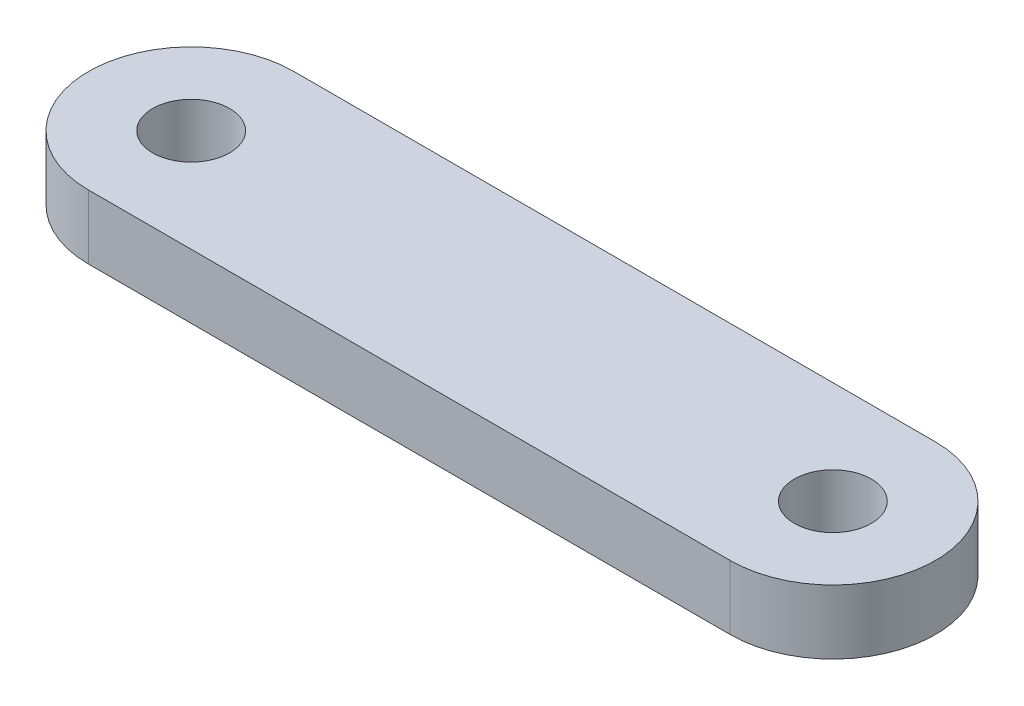
ISO-10303-21;
HEADER;
FILE_DESCRIPTION(('STEP AP214'),'2;1');
FILE_NAME('part.step','',(''),(''),'','','');
FILE_SCHEMA(('AUTOMOTIVE_DESIGN { 1 0 10303 214 1 1 1 1 }'));
ENDSEC;
DATA;
#1=APPLICATION_CONTEXT('core data for automotive mechanical design processes');
#2=APPLICATION_PROTOCOL_DEFINITION('international standard','automotive_design',2000,#1);
#3=PRODUCT_CONTEXT('',#1,'mechanical');
#4=PRODUCT('Part','Part','',(#3));
#5=PRODUCT_RELATED_PRODUCT_CATEGORY('part','',(#4));
#6=PRODUCT_DEFINITION_FORMATION('','',#4);
#7=PRODUCT_DEFINITION_CONTEXT('part definition',#1,'design');
#8=PRODUCT_DEFINITION('design','',#6,#7);
#9=PRODUCT_DEFINITION_SHAPE('','',#8);
#10=(LENGTH_UNIT() NAMED_UNIT(*) SI_UNIT(.MILLI.,.METRE.));
#11=(NAMED_UNIT(*) PLANE_ANGLE_UNIT() SI_UNIT($,.RADIAN.));
#12=(NAMED_UNIT(*) SI_UNIT($,.STERADIAN.) SOLID_ANGLE_UNIT());
#13=UNCERTAINTY_MEASURE_WITH_UNIT(LENGTH_MEASURE(1.E-05),#10,'distance_accuracy_value','');
#14=(GEOMETRIC_REPRESENTATION_CONTEXT(3) GLOBAL_UNCERTAINTY_ASSIGNED_CONTEXT((#13)) GLOBAL_UNIT_ASSIGNED_CONTEXT((#10,
#11,#12)) REPRESENTATION_CONTEXT('',''));
#15=CARTESIAN_POINT('',(0.,0.,0.));
#16=DIRECTION('',(0.,0.,1.));
#17=DIRECTION('',(1.,0.,0.));
#18=AXIS2_PLACEMENT_3D('',#15,#16,#17);
#19=CARTESIAN_POINT('',(-25.,5.,0.));
#20=DIRECTION('',(0.,1.,0.));
#21=DIRECTION('',(0.,0.,1.));
#22=AXIS2_PLACEMENT_3D('',#19,#20,#21);
#23=PLANE('',#22);
#24=CARTESIAN_POINT('',(-25.,5.,0.));
#25=DIRECTION('',(0.,1.,0.));
#26=DIRECTION('',(0.,0.,1.));
#27=AXIS2_PLACEMENT_3D('',#24,#25,#26);
#28=CIRCLE('',#27,3.);
#29=CARTESIAN_POINT('',(-25.,5.,3.));
#30=VERTEX_POINT('',#29);
#31=EDGE_CURVE('E112',#30,#30,#28,.T.);
#32=ORIENTED_EDGE('',*,*,#31,.F.);
#33=EDGE_LOOP('',(#32));
#34=FACE_BOUND('',#33,.T.);
#35=CARTESIAN_POINT('',(-25.,5.,0.));
#36=DIRECTION('',(0.,1.,0.));
#37=DIRECTION('',(0.,0.,1.));
#38=AXIS2_PLACEMENT_3D('',#35,#36,#37);
#39=CIRCLE('',#38,8.00000000000001);
#40=CARTESIAN_POINT('',(-25.,5.,-8.00000000000001));
#41=VERTEX_POINT('',#40);
#42=CARTESIAN_POINT('',(-25.,5.,8.00000000000001));
#43=VERTEX_POINT('',#42);
#44=EDGE_CURVE('E92',#41,#43,#39,.T.);
#45=ORIENTED_EDGE('',*,*,#44,.T.);
#46=DIRECTION('',(1.,0.,0.));
#47=VECTOR('',#46,1.);
#48=CARTESIAN_POINT('',(-25.,5.,8.00000000000001));
#49=LINE('',#48,#47);
#50=CARTESIAN_POINT('',(25.,5.,8.));
#51=VERTEX_POINT('',#50);
#52=EDGE_CURVE('E87',#43,#51,#49,.T.);
#53=ORIENTED_EDGE('',*,*,#52,.T.);
#54=CARTESIAN_POINT('',(25.,5.,0.));
#55=DIRECTION('',(0.,1.,0.));
#56=DIRECTION('',(0.,0.,1.));
#57=AXIS2_PLACEMENT_3D('',#54,#55,#56);
#58=CIRCLE('',#57,8.00000000000001);
#59=CARTESIAN_POINT('',(25.,5.,-8.00000000000002));
#60=VERTEX_POINT('',#59);
#61=EDGE_CURVE('E90',#51,#60,#58,.T.);
#62=ORIENTED_EDGE('',*,*,#61,.T.);
#63=DIRECTION('',(-1.,0.,0.));
#64=VECTOR('',#63,1.);
#65=CARTESIAN_POINT('',(-25.,5.,-8.00000000000001));
#66=LINE('',#65,#64);
#67=EDGE_CURVE('E57',#60,#41,#66,.T.);
#68=ORIENTED_EDGE('',*,*,#67,.T.);
#69=EDGE_LOOP('',(#45,#53,#62,#68));
#70=FACE_BOUND('',#69,.T.);
#71=CARTESIAN_POINT('',(25.,5.,0.));
#72=DIRECTION('',(0.,1.,0.));
#73=DIRECTION('',(0.,0.,1.));
#74=AXIS2_PLACEMENT_3D('',#71,#72,#73);
#75=CIRCLE('',#74,3.);
#76=CARTESIAN_POINT('',(25.,5.,2.99999999999999));
#77=VERTEX_POINT('',#76);
#78=EDGE_CURVE('E134',#77,#77,#75,.T.);
#79=ORIENTED_EDGE('',*,*,#78,.F.);
#80=EDGE_LOOP('',(#79));
#81=FACE_BOUND('',#80,.T.);
#82=ADVANCED_FACE('F39',(#34,#70,#81),#23,.T.);
#83=CARTESIAN_POINT('',(-25.,0.,0.));
#84=DIRECTION('',(0.,1.,0.));
#85=DIRECTION('',(0.,0.,1.));
#86=AXIS2_PLACEMENT_3D('',#83,#84,#85);
#87=PLANE('',#86);
#88=CARTESIAN_POINT('',(-25.,0.,0.));
#89=DIRECTION('',(0.,1.,0.));
#90=DIRECTION('',(0.,0.,1.));
#91=AXIS2_PLACEMENT_3D('',#88,#89,#90);
#92=CIRCLE('',#91,8.00000000000001);
#93=CARTESIAN_POINT('',(-25.,0.,-8.00000000000001));
#94=VERTEX_POINT('',#93);
#95=CARTESIAN_POINT('',(-25.,0.,8.00000000000001));
#96=VERTEX_POINT('',#95);
#97=EDGE_CURVE('E108',#94,#96,#92,.T.);
#98=ORIENTED_EDGE('',*,*,#97,.F.);
#99=DIRECTION('',(-1.,0.,0.));
#100=VECTOR('',#99,1.);
#101=CARTESIAN_POINT('',(-25.,0.,-8.00000000000001));
#102=LINE('',#101,#100);
#103=CARTESIAN_POINT('',(25.,0.,-8.00000000000002));
#104=VERTEX_POINT('',#103);
#105=EDGE_CURVE('E80',#104,#94,#102,.T.);
#106=ORIENTED_EDGE('',*,*,#105,.F.);
#107=CARTESIAN_POINT('',(25.,0.,0.));
#108=DIRECTION('',(0.,1.,0.));
#109=DIRECTION('',(0.,0.,1.));
#110=AXIS2_PLACEMENT_3D('',#107,#108,#109);
#111=CIRCLE('',#110,8.00000000000001);
#112=CARTESIAN_POINT('',(25.,0.,8.));
#113=VERTEX_POINT('',#112);
#114=EDGE_CURVE('E74',#113,#104,#111,.T.);
#115=ORIENTED_EDGE('',*,*,#114,.F.);
#116=DIRECTION('',(1.,0.,0.));
#117=VECTOR('',#116,1.);
#118=CARTESIAN_POINT('',(-25.,0.,8.00000000000001));
#119=LINE('',#118,#117);
#120=EDGE_CURVE('E97',#96,#113,#119,.T.);
#121=ORIENTED_EDGE('',*,*,#120,.F.);
#122=EDGE_LOOP('',(#98,#106,#115,#121));
#123=FACE_BOUND('',#122,.T.);
#124=CARTESIAN_POINT('',(-25.,0.,0.));
#125=DIRECTION('',(0.,1.,0.));
#126=DIRECTION('',(0.,0.,1.));
#127=AXIS2_PLACEMENT_3D('',#124,#125,#126);
#128=CIRCLE('',#127,3.);
#129=CARTESIAN_POINT('',(-25.,0.,3.));
#130=VERTEX_POINT('',#129);
#131=EDGE_CURVE('E130',#130,#130,#128,.T.);
#132=ORIENTED_EDGE('',*,*,#131,.T.);
#133=EDGE_LOOP('',(#132));
#134=FACE_BOUND('',#133,.T.);
#135=CARTESIAN_POINT('',(25.,0.,0.));
#136=DIRECTION('',(0.,1.,0.));
#137=DIRECTION('',(0.,0.,1.));
#138=AXIS2_PLACEMENT_3D('',#135,#136,#137);
#139=CIRCLE('',#138,3.);
#140=CARTESIAN_POINT('',(25.,0.,2.99999999999999));
#141=VERTEX_POINT('',#140);
#142=EDGE_CURVE('E138',#141,#141,#139,.T.);
#143=ORIENTED_EDGE('',*,*,#142,.T.);
#144=EDGE_LOOP('',(#143));
#145=FACE_BOUND('',#144,.T.);
#146=ADVANCED_FACE('F125',(#123,#134,#145),#87,.F.);
#147=CARTESIAN_POINT('',(-25.,5.,0.));
#148=DIRECTION('',(0.,-1.,0.));
#149=DIRECTION('',(0.,0.,-1.));
#150=AXIS2_PLACEMENT_3D('',#147,#148,#149);
#151=CYLINDRICAL_SURFACE('',#150,8.00000000000001);
#152=ORIENTED_EDGE('',*,*,#97,.T.);
#153=DIRECTION('',(0.,-1.,0.));
#154=VECTOR('',#153,1.);
#155=CARTESIAN_POINT('',(-25.,5.,8.00000000000001));
#156=LINE('',#155,#154);
#157=EDGE_CURVE('E11',#43,#96,#156,.T.);
#158=ORIENTED_EDGE('',*,*,#157,.F.);
#159=ORIENTED_EDGE('',*,*,#44,.F.);
#160=DIRECTION('',(0.,-1.,0.));
#161=VECTOR('',#160,1.);
#162=CARTESIAN_POINT('',(-25.,5.,-8.00000000000001));
#163=LINE('',#162,#161);
#164=EDGE_CURVE('E104',#41,#94,#163,.T.);
#165=ORIENTED_EDGE('',*,*,#164,.T.);
#166=EDGE_LOOP('',(#152,#158,#159,#165));
#167=FACE_BOUND('',#166,.T.);
#168=ADVANCED_FACE('F41',(#167),#151,.T.);
#169=CARTESIAN_POINT('',(-25.,5.,8.00000000000001));
#170=DIRECTION('',(0.,0.,-1.));
#171=DIRECTION('',(-1.,0.,0.));
#172=AXIS2_PLACEMENT_3D('',#169,#170,#171);
#173=PLANE('',#172);
#174=ORIENTED_EDGE('',*,*,#120,.T.);
#175=DIRECTION('',(0.,-1.,0.));
#176=VECTOR('',#175,1.);
#177=CARTESIAN_POINT('',(25.,5.,8.));
#178=LINE('',#177,#176);
#179=EDGE_CURVE('E49',#51,#113,#178,.T.);
#180=ORIENTED_EDGE('',*,*,#179,.F.);
#181=ORIENTED_EDGE('',*,*,#52,.F.);
#182=ORIENTED_EDGE('',*,*,#157,.T.);
#183=EDGE_LOOP('',(#174,#180,#181,#182));
#184=FACE_BOUND('',#183,.T.);
#185=ADVANCED_FACE('F96',(#184),#173,.F.);
#186=CARTESIAN_POINT('',(25.,5.,0.));
#187=DIRECTION('',(0.,-1.,0.));
#188=DIRECTION('',(0.,0.,-1.));
#189=AXIS2_PLACEMENT_3D('',#186,#187,#188);
#190=CYLINDRICAL_SURFACE('',#189,8.00000000000001);
#191=ORIENTED_EDGE('',*,*,#114,.T.);
#192=DIRECTION('',(0.,-1.,0.));
#193=VECTOR('',#192,1.);
#194=CARTESIAN_POINT('',(25.,5.,-8.00000000000002));
#195=LINE('',#194,#193);
#196=EDGE_CURVE('E99',#60,#104,#195,.T.);
#197=ORIENTED_EDGE('',*,*,#196,.F.);
#198=ORIENTED_EDGE('',*,*,#61,.F.);
#199=ORIENTED_EDGE('',*,*,#179,.T.);
#200=EDGE_LOOP('',(#191,#197,#198,#199));
#201=FACE_BOUND('',#200,.T.);
#202=ADVANCED_FACE('F100',(#201),#190,.T.);
#203=CARTESIAN_POINT('',(-25.,5.,-8.00000000000001));
#204=DIRECTION('',(0.,0.,1.));
#205=DIRECTION('',(1.,0.,0.));
#206=AXIS2_PLACEMENT_3D('',#203,#204,#205);
#207=PLANE('',#206);
#208=ORIENTED_EDGE('',*,*,#105,.T.);
#209=ORIENTED_EDGE('',*,*,#164,.F.);
#210=ORIENTED_EDGE('',*,*,#67,.F.);
#211=ORIENTED_EDGE('',*,*,#196,.T.);
#212=EDGE_LOOP('',(#208,#209,#210,#211));
#213=FACE_BOUND('',#212,.T.);
#214=ADVANCED_FACE('F122',(#213),#207,.F.);
#215=CARTESIAN_POINT('',(-25.,5.,0.));
#216=DIRECTION('',(0.,-1.,0.));
#217=DIRECTION('',(0.,0.,-1.));
#218=AXIS2_PLACEMENT_3D('',#215,#216,#217);
#219=CYLINDRICAL_SURFACE('',#218,3.);
#220=ORIENTED_EDGE('',*,*,#31,.T.);
#221=EDGE_LOOP('',(#220));
#222=FACE_BOUND('',#221,.T.);
#223=ORIENTED_EDGE('',*,*,#131,.F.);
#224=EDGE_LOOP('',(#223));
#225=FACE_BOUND('',#224,.T.);
#226=ADVANCED_FACE('F157',(#222,#225),#219,.F.);
#227=CARTESIAN_POINT('',(25.,5.,0.));
#228=DIRECTION('',(0.,-1.,0.));
#229=DIRECTION('',(0.,0.,-1.));
#230=AXIS2_PLACEMENT_3D('',#227,#228,#229);
#231=CYLINDRICAL_SURFACE('',#230,3.);
#232=ORIENTED_EDGE('',*,*,#78,.T.);
#233=EDGE_LOOP('',(#232));
#234=FACE_BOUND('',#233,.T.);
#235=ORIENTED_EDGE('',*,*,#142,.F.);
#236=EDGE_LOOP('',(#235));
#237=FACE_BOUND('',#236,.T.);
#238=ADVANCED_FACE('F146',(#234,#237),#231,.F.);
#239=CLOSED_SHELL('',(#82,#146,#168,#185,#202,#214,#226,#238));
#240=MANIFOLD_SOLID_BREP('B2',#239);
#241=ADVANCED_BREP_SHAPE_REPRESENTATION('',(#18,#240),#14);
#242=SHAPE_DEFINITION_REPRESENTATION(#9,#241);
ENDSEC;
END-ISO-10303-21;
